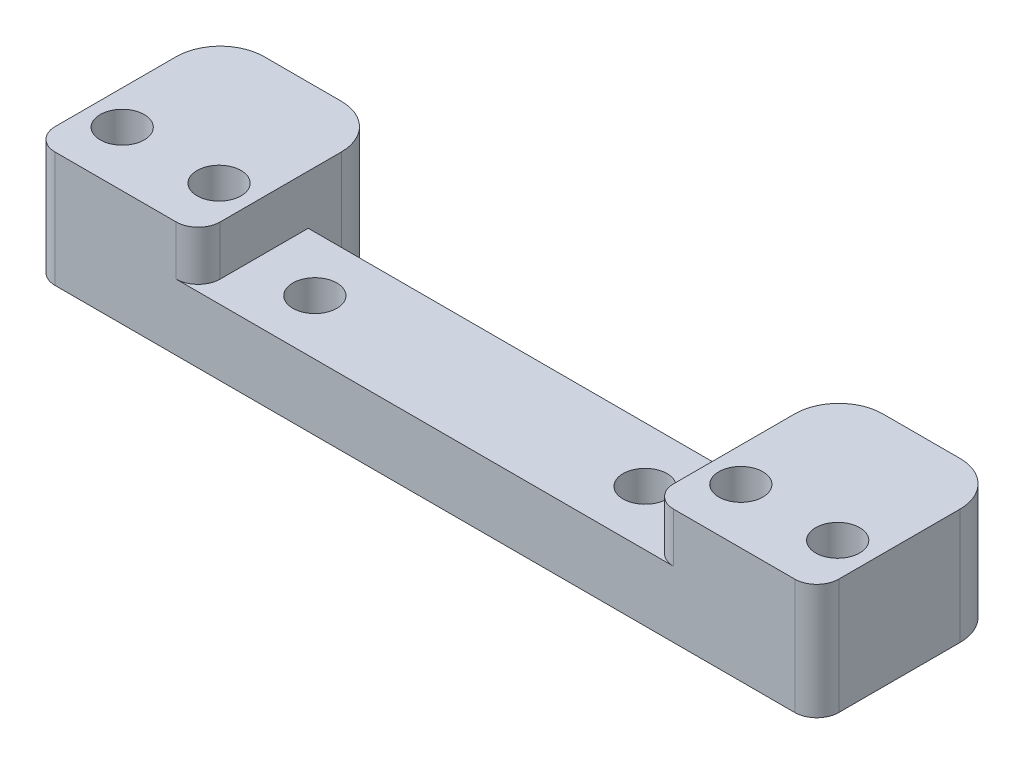
ISO-10303-21;
HEADER;
FILE_DESCRIPTION(('STEP AP214'),'2;1');
FILE_NAME('part.step','',(''),(''),'','','');
FILE_SCHEMA(('AUTOMOTIVE_DESIGN { 1 0 10303 214 1 1 1 1 }'));
ENDSEC;
DATA;
#1=APPLICATION_CONTEXT('core data for automotive mechanical design processes');
#2=APPLICATION_PROTOCOL_DEFINITION('international standard','automotive_design',2000,#1);
#3=PRODUCT_CONTEXT('',#1,'mechanical');
#4=PRODUCT('Part','Part','',(#3));
#5=PRODUCT_RELATED_PRODUCT_CATEGORY('part','',(#4));
#6=PRODUCT_DEFINITION_FORMATION('','',#4);
#7=PRODUCT_DEFINITION_CONTEXT('part definition',#1,'design');
#8=PRODUCT_DEFINITION('design','',#6,#7);
#9=PRODUCT_DEFINITION_SHAPE('','',#8);
#10=(LENGTH_UNIT() NAMED_UNIT(*) SI_UNIT(.MILLI.,.METRE.));
#11=(NAMED_UNIT(*) PLANE_ANGLE_UNIT() SI_UNIT($,.RADIAN.));
#12=(NAMED_UNIT(*) SI_UNIT($,.STERADIAN.) SOLID_ANGLE_UNIT());
#13=UNCERTAINTY_MEASURE_WITH_UNIT(LENGTH_MEASURE(1.E-05),#10,'distance_accuracy_value','');
#14=(GEOMETRIC_REPRESENTATION_CONTEXT(3) GLOBAL_UNCERTAINTY_ASSIGNED_CONTEXT((#13)) GLOBAL_UNIT_ASSIGNED_CONTEXT((#10,
#11,#12)) REPRESENTATION_CONTEXT('',''));
#15=CARTESIAN_POINT('',(0.,0.,0.));
#16=DIRECTION('',(0.,0.,1.));
#17=DIRECTION('',(1.,0.,0.));
#18=AXIS2_PLACEMENT_3D('',#15,#16,#17);
#19=CARTESIAN_POINT('',(0.,6.,0.));
#20=DIRECTION('',(0.,1.,0.));
#21=DIRECTION('',(0.,0.,1.));
#22=AXIS2_PLACEMENT_3D('',#19,#20,#21);
#23=PLANE('',#22);
#24=CARTESIAN_POINT('',(15.,6.,0.));
#25=DIRECTION('',(0.,1.,0.));
#26=DIRECTION('',(0.,0.,1.));
#27=AXIS2_PLACEMENT_3D('',#24,#25,#26);
#28=CIRCLE('',#27,2.);
#29=CARTESIAN_POINT('',(15.,6.,2.));
#30=VERTEX_POINT('',#29);
#31=EDGE_CURVE('E245',#30,#30,#28,.T.);
#32=ORIENTED_EDGE('',*,*,#31,.F.);
#33=EDGE_LOOP('',(#32));
#34=FACE_BOUND('',#33,.T.);
#35=CARTESIAN_POINT('',(-15.,6.,0.));
#36=DIRECTION('',(0.,1.,0.));
#37=DIRECTION('',(0.,0.,1.));
#38=AXIS2_PLACEMENT_3D('',#35,#36,#37);
#39=CIRCLE('',#38,2.);
#40=CARTESIAN_POINT('',(-15.,6.,1.99999999999999));
#41=VERTEX_POINT('',#40);
#42=EDGE_CURVE('E251',#41,#41,#39,.T.);
#43=ORIENTED_EDGE('',*,*,#42,.F.);
#44=EDGE_LOOP('',(#43));
#45=FACE_BOUND('',#44,.T.);
#46=DIRECTION('',(-1.,0.,0.));
#47=VECTOR('',#46,1.);
#48=CARTESIAN_POINT('',(-35.6,6.,-5.));
#49=LINE('',#48,#47);
#50=CARTESIAN_POINT('',(20.6,6.,-5.00000000000001));
#51=VERTEX_POINT('',#50);
#52=CARTESIAN_POINT('',(-20.6,6.,-5.));
#53=VERTEX_POINT('',#52);
#54=EDGE_CURVE('E269',#51,#53,#49,.T.);
#55=ORIENTED_EDGE('',*,*,#54,.T.);
#56=DIRECTION('',(0.,0.,-1.));
#57=VECTOR('',#56,1.);
#58=CARTESIAN_POINT('',(-20.6,6.,5.));
#59=LINE('',#58,#57);
#60=CARTESIAN_POINT('',(-20.6,6.,3.));
#61=VERTEX_POINT('',#60);
#62=EDGE_CURVE('E200',#61,#53,#59,.T.);
#63=ORIENTED_EDGE('',*,*,#62,.F.);
#64=CARTESIAN_POINT('',(-22.6,6.,3.));
#65=DIRECTION('',(0.,1.,0.));
#66=DIRECTION('',(0.,0.,1.));
#67=AXIS2_PLACEMENT_3D('',#64,#65,#66);
#68=CIRCLE('',#67,2.);
#69=CARTESIAN_POINT('',(-22.6,6.,5.));
#70=VERTEX_POINT('',#69);
#71=EDGE_CURVE('E11',#61,#70,#68,.F.);
#72=ORIENTED_EDGE('',*,*,#71,.T.);
#73=DIRECTION('',(1.,0.,0.));
#74=VECTOR('',#73,1.);
#75=CARTESIAN_POINT('',(-35.6,6.,5.));
#76=LINE('',#75,#74);
#77=CARTESIAN_POINT('',(22.6,6.,4.99999999999999));
#78=VERTEX_POINT('',#77);
#79=EDGE_CURVE('E272',#70,#78,#76,.T.);
#80=ORIENTED_EDGE('',*,*,#79,.T.);
#81=CARTESIAN_POINT('',(22.6,6.,2.99999999999999));
#82=DIRECTION('',(0.,1.,0.));
#83=DIRECTION('',(0.,0.,1.));
#84=AXIS2_PLACEMENT_3D('',#81,#82,#83);
#85=CIRCLE('',#84,2.);
#86=CARTESIAN_POINT('',(20.6,6.,2.99999999999999));
#87=VERTEX_POINT('',#86);
#88=EDGE_CURVE('E48',#78,#87,#85,.F.);
#89=ORIENTED_EDGE('',*,*,#88,.T.);
#90=DIRECTION('',(0.,0.,1.));
#91=VECTOR('',#90,1.);
#92=CARTESIAN_POINT('',(20.6,6.,-8.));
#93=LINE('',#92,#91);
#94=EDGE_CURVE('E184',#51,#87,#93,.T.);
#95=ORIENTED_EDGE('',*,*,#94,.F.);
#96=EDGE_LOOP('',(#55,#63,#72,#80,#89,#95));
#97=FACE_BOUND('',#96,.T.);
#98=ADVANCED_FACE('F40',(#34,#45,#97),#23,.T.);
#99=CARTESIAN_POINT('',(0.,0.,0.));
#100=DIRECTION('',(0.,1.,0.));
#101=DIRECTION('',(0.,0.,1.));
#102=AXIS2_PLACEMENT_3D('',#99,#100,#101);
#103=PLANE('',#102);
#104=DIRECTION('',(0.,0.,-1.));
#105=VECTOR('',#104,1.);
#106=CARTESIAN_POINT('',(35.6,0.,-5.00000000000001));
#107=LINE('',#106,#105);
#108=CARTESIAN_POINT('',(35.6,0.,2.99999999999999));
#109=VERTEX_POINT('',#108);
#110=CARTESIAN_POINT('',(35.6,0.,-8.));
#111=VERTEX_POINT('',#110);
#112=EDGE_CURVE('E268',#109,#111,#107,.T.);
#113=ORIENTED_EDGE('',*,*,#112,.F.);
#114=CARTESIAN_POINT('',(33.6,0.,2.99999999999999));
#115=DIRECTION('',(0.,1.,0.));
#116=DIRECTION('',(0.,0.,1.));
#117=AXIS2_PLACEMENT_3D('',#114,#115,#116);
#118=CIRCLE('',#117,2.);
#119=CARTESIAN_POINT('',(33.6,0.,4.99999999999999));
#120=VERTEX_POINT('',#119);
#121=EDGE_CURVE('E310',#109,#120,#118,.F.);
#122=ORIENTED_EDGE('',*,*,#121,.T.);
#123=DIRECTION('',(1.,0.,0.));
#124=VECTOR('',#123,1.);
#125=CARTESIAN_POINT('',(-35.6,0.,5.));
#126=LINE('',#125,#124);
#127=CARTESIAN_POINT('',(-33.6,0.,5.));
#128=VERTEX_POINT('',#127);
#129=EDGE_CURVE('E273',#128,#120,#126,.T.);
#130=ORIENTED_EDGE('',*,*,#129,.F.);
#131=CARTESIAN_POINT('',(-33.6,0.,3.));
#132=DIRECTION('',(0.,1.,0.));
#133=DIRECTION('',(0.,0.,1.));
#134=AXIS2_PLACEMENT_3D('',#131,#132,#133);
#135=CIRCLE('',#134,2.);
#136=CARTESIAN_POINT('',(-35.6,0.,3.));
#137=VERTEX_POINT('',#136);
#138=EDGE_CURVE('E308',#128,#137,#135,.F.);
#139=ORIENTED_EDGE('',*,*,#138,.T.);
#140=DIRECTION('',(0.,0.,1.));
#141=VECTOR('',#140,1.);
#142=CARTESIAN_POINT('',(-35.6,0.,-5.));
#143=LINE('',#142,#141);
#144=CARTESIAN_POINT('',(-35.6,0.,-8.));
#145=VERTEX_POINT('',#144);
#146=EDGE_CURVE('E280',#145,#137,#143,.T.);
#147=ORIENTED_EDGE('',*,*,#146,.F.);
#148=CARTESIAN_POINT('',(-31.6,0.,-8.));
#149=DIRECTION('',(0.,1.,0.));
#150=DIRECTION('',(0.,0.,1.));
#151=AXIS2_PLACEMENT_3D('',#148,#149,#150);
#152=CIRCLE('',#151,4.);
#153=CARTESIAN_POINT('',(-31.6,0.,-12.));
#154=VERTEX_POINT('',#153);
#155=EDGE_CURVE('E293',#145,#154,#152,.F.);
#156=ORIENTED_EDGE('',*,*,#155,.T.);
#157=DIRECTION('',(1.,0.,0.));
#158=VECTOR('',#157,1.);
#159=CARTESIAN_POINT('',(-35.6,0.,-12.));
#160=LINE('',#159,#158);
#161=CARTESIAN_POINT('',(-24.6,0.,-12.));
#162=VERTEX_POINT('',#161);
#163=EDGE_CURVE('E238',#154,#162,#160,.T.);
#164=ORIENTED_EDGE('',*,*,#163,.T.);
#165=CARTESIAN_POINT('',(-24.6,0.,-8.));
#166=DIRECTION('',(0.,1.,0.));
#167=DIRECTION('',(0.,0.,1.));
#168=AXIS2_PLACEMENT_3D('',#165,#166,#167);
#169=CIRCLE('',#168,4.);
#170=CARTESIAN_POINT('',(-20.6,0.,-8.));
#171=VERTEX_POINT('',#170);
#172=EDGE_CURVE('E291',#162,#171,#169,.F.);
#173=ORIENTED_EDGE('',*,*,#172,.T.);
#174=DIRECTION('',(0.,0.,1.));
#175=VECTOR('',#174,1.);
#176=CARTESIAN_POINT('',(-20.6,0.,5.));
#177=LINE('',#176,#175);
#178=CARTESIAN_POINT('',(-20.6,0.,-5.));
#179=VERTEX_POINT('',#178);
#180=EDGE_CURVE('E181',#171,#179,#177,.T.);
#181=ORIENTED_EDGE('',*,*,#180,.T.);
#182=DIRECTION('',(-1.,0.,0.));
#183=VECTOR('',#182,1.);
#184=CARTESIAN_POINT('',(-35.6,0.,-5.));
#185=LINE('',#184,#183);
#186=CARTESIAN_POINT('',(20.6,0.,-5.00000000000001));
#187=VERTEX_POINT('',#186);
#188=EDGE_CURVE('E277',#187,#179,#185,.T.);
#189=ORIENTED_EDGE('',*,*,#188,.F.);
#190=DIRECTION('',(0.,0.,-1.));
#191=VECTOR('',#190,1.);
#192=CARTESIAN_POINT('',(20.6,0.,5.));
#193=LINE('',#192,#191);
#194=CARTESIAN_POINT('',(20.6,0.,-8.));
#195=VERTEX_POINT('',#194);
#196=EDGE_CURVE('E225',#187,#195,#193,.T.);
#197=ORIENTED_EDGE('',*,*,#196,.T.);
#198=CARTESIAN_POINT('',(24.6,0.,-8.));
#199=DIRECTION('',(0.,1.,0.));
#200=DIRECTION('',(0.,0.,1.));
#201=AXIS2_PLACEMENT_3D('',#198,#199,#200);
#202=CIRCLE('',#201,4.);
#203=CARTESIAN_POINT('',(24.6,0.,-12.));
#204=VERTEX_POINT('',#203);
#205=EDGE_CURVE('E295',#195,#204,#202,.F.);
#206=ORIENTED_EDGE('',*,*,#205,.T.);
#207=DIRECTION('',(1.,0.,0.));
#208=VECTOR('',#207,1.);
#209=CARTESIAN_POINT('',(35.6,0.,-12.));
#210=LINE('',#209,#208);
#211=CARTESIAN_POINT('',(31.6,0.,-12.));
#212=VERTEX_POINT('',#211);
#213=EDGE_CURVE('E229',#204,#212,#210,.T.);
#214=ORIENTED_EDGE('',*,*,#213,.T.);
#215=CARTESIAN_POINT('',(31.6,0.,-8.));
#216=DIRECTION('',(0.,1.,0.));
#217=DIRECTION('',(0.,0.,1.));
#218=AXIS2_PLACEMENT_3D('',#215,#216,#217);
#219=CIRCLE('',#218,4.);
#220=EDGE_CURVE('E297',#212,#111,#219,.F.);
#221=ORIENTED_EDGE('',*,*,#220,.T.);
#222=EDGE_LOOP('',(#113,#122,#130,#139,#147,#156,#164,#173,#181,#189,#197,#206,#214,#221));
#223=FACE_BOUND('',#222,.T.);
#224=CARTESIAN_POINT('',(-15.,0.,0.));
#225=DIRECTION('',(0.,1.,0.));
#226=DIRECTION('',(0.,0.,1.));
#227=AXIS2_PLACEMENT_3D('',#224,#225,#226);
#228=CIRCLE('',#227,2.);
#229=CARTESIAN_POINT('',(-15.,0.,1.99999999999999));
#230=VERTEX_POINT('',#229);
#231=EDGE_CURVE('E248',#230,#230,#228,.T.);
#232=ORIENTED_EDGE('',*,*,#231,.T.);
#233=EDGE_LOOP('',(#232));
#234=FACE_BOUND('',#233,.T.);
#235=CARTESIAN_POINT('',(15.,0.,0.));
#236=DIRECTION('',(0.,1.,0.));
#237=DIRECTION('',(0.,0.,1.));
#238=AXIS2_PLACEMENT_3D('',#235,#236,#237);
#239=CIRCLE('',#238,2.);
#240=CARTESIAN_POINT('',(15.,0.,2.));
#241=VERTEX_POINT('',#240);
#242=EDGE_CURVE('E244',#241,#241,#239,.T.);
#243=ORIENTED_EDGE('',*,*,#242,.T.);
#244=EDGE_LOOP('',(#243));
#245=FACE_BOUND('',#244,.T.);
#246=CARTESIAN_POINT('',(-23.7,0.,0.));
#247=DIRECTION('',(0.,1.,0.));
#248=DIRECTION('',(0.,0.,1.));
#249=AXIS2_PLACEMENT_3D('',#246,#247,#248);
#250=CIRCLE('',#249,2.);
#251=CARTESIAN_POINT('',(-23.7,0.,2.));
#252=VERTEX_POINT('',#251);
#253=EDGE_CURVE('E262',#252,#252,#250,.T.);
#254=ORIENTED_EDGE('',*,*,#253,.T.);
#255=EDGE_LOOP('',(#254));
#256=FACE_BOUND('',#255,.T.);
#257=CARTESIAN_POINT('',(-32.5,0.,0.));
#258=DIRECTION('',(0.,1.,0.));
#259=DIRECTION('',(0.,0.,1.));
#260=AXIS2_PLACEMENT_3D('',#257,#258,#259);
#261=CIRCLE('',#260,2.);
#262=CARTESIAN_POINT('',(-32.5,0.,2.));
#263=VERTEX_POINT('',#262);
#264=EDGE_CURVE('E265',#263,#263,#261,.T.);
#265=ORIENTED_EDGE('',*,*,#264,.T.);
#266=EDGE_LOOP('',(#265));
#267=FACE_BOUND('',#266,.T.);
#268=CARTESIAN_POINT('',(32.5,0.,0.));
#269=DIRECTION('',(0.,1.,0.));
#270=DIRECTION('',(0.,0.,1.));
#271=AXIS2_PLACEMENT_3D('',#268,#269,#270);
#272=CIRCLE('',#271,2.);
#273=CARTESIAN_POINT('',(32.5,0.,2.));
#274=VERTEX_POINT('',#273);
#275=EDGE_CURVE('E254',#274,#274,#272,.T.);
#276=ORIENTED_EDGE('',*,*,#275,.T.);
#277=EDGE_LOOP('',(#276));
#278=FACE_BOUND('',#277,.T.);
#279=CARTESIAN_POINT('',(23.7,0.,0.));
#280=DIRECTION('',(0.,1.,0.));
#281=DIRECTION('',(0.,0.,1.));
#282=AXIS2_PLACEMENT_3D('',#279,#280,#281);
#283=CIRCLE('',#282,2.);
#284=CARTESIAN_POINT('',(23.7,0.,2.));
#285=VERTEX_POINT('',#284);
#286=EDGE_CURVE('E259',#285,#285,#283,.T.);
#287=ORIENTED_EDGE('',*,*,#286,.T.);
#288=EDGE_LOOP('',(#287));
#289=FACE_BOUND('',#288,.T.);
#290=ADVANCED_FACE('F376',(#223,#234,#245,#256,#267,#278,#289),#103,.F.);
#291=CARTESIAN_POINT('',(35.6,6.,-5.00000000000001));
#292=DIRECTION('',(-1.,0.,0.));
#293=DIRECTION('',(0.,0.,1.));
#294=AXIS2_PLACEMENT_3D('',#291,#292,#293);
#295=PLANE('',#294);
#296=DIRECTION('',(0.,0.,-1.));
#297=VECTOR('',#296,1.);
#298=CARTESIAN_POINT('',(35.6,10.5,4.99999999999999));
#299=LINE('',#298,#297);
#300=CARTESIAN_POINT('',(35.6,10.5,2.99999999999999));
#301=VERTEX_POINT('',#300);
#302=CARTESIAN_POINT('',(35.6,10.5,-8.));
#303=VERTEX_POINT('',#302);
#304=EDGE_CURVE('E223',#301,#303,#299,.T.);
#305=ORIENTED_EDGE('',*,*,#304,.F.);
#306=DIRECTION('',(0.,-1.,0.));
#307=VECTOR('',#306,1.);
#308=CARTESIAN_POINT('',(35.6,6.,2.99999999999999));
#309=LINE('',#308,#307);
#310=EDGE_CURVE('E228',#301,#109,#309,.T.);
#311=ORIENTED_EDGE('',*,*,#310,.T.);
#312=ORIENTED_EDGE('',*,*,#112,.T.);
#313=DIRECTION('',(0.,1.,0.));
#314=VECTOR('',#313,1.);
#315=CARTESIAN_POINT('',(35.6,6.,-8.));
#316=LINE('',#315,#314);
#317=EDGE_CURVE('E275',#111,#303,#316,.T.);
#318=ORIENTED_EDGE('',*,*,#317,.T.);
#319=EDGE_LOOP('',(#305,#311,#312,#318));
#320=FACE_BOUND('',#319,.T.);
#321=ADVANCED_FACE('F361',(#320),#295,.F.);
#322=CARTESIAN_POINT('',(-35.6,6.,-5.));
#323=DIRECTION('',(0.,0.,1.));
#324=DIRECTION('',(1.,0.,0.));
#325=AXIS2_PLACEMENT_3D('',#322,#323,#324);
#326=PLANE('',#325);
#327=ORIENTED_EDGE('',*,*,#54,.F.);
#328=DIRECTION('',(0.,-1.,0.));
#329=VECTOR('',#328,1.);
#330=CARTESIAN_POINT('',(20.6,6.,-5.00000000000001));
#331=LINE('',#330,#329);
#332=EDGE_CURVE('E232',#51,#187,#331,.T.);
#333=ORIENTED_EDGE('',*,*,#332,.T.);
#334=ORIENTED_EDGE('',*,*,#188,.T.);
#335=DIRECTION('',(0.,1.,0.));
#336=VECTOR('',#335,1.);
#337=CARTESIAN_POINT('',(-20.6,6.,-5.));
#338=LINE('',#337,#336);
#339=EDGE_CURVE('E241',#179,#53,#338,.T.);
#340=ORIENTED_EDGE('',*,*,#339,.T.);
#341=EDGE_LOOP('',(#327,#333,#334,#340));
#342=FACE_BOUND('',#341,.T.);
#343=ADVANCED_FACE('F380',(#342),#326,.F.);
#344=CARTESIAN_POINT('',(-35.6,6.,-5.));
#345=DIRECTION('',(1.,0.,0.));
#346=DIRECTION('',(0.,0.,-1.));
#347=AXIS2_PLACEMENT_3D('',#344,#345,#346);
#348=PLANE('',#347);
#349=ORIENTED_EDGE('',*,*,#146,.T.);
#350=DIRECTION('',(0.,-1.,0.));
#351=VECTOR('',#350,1.);
#352=CARTESIAN_POINT('',(-35.6,6.,3.));
#353=LINE('',#352,#351);
#354=CARTESIAN_POINT('',(-35.6,10.5,3.));
#355=VERTEX_POINT('',#354);
#356=EDGE_CURVE('E328',#137,#355,#353,.F.);
#357=ORIENTED_EDGE('',*,*,#356,.T.);
#358=DIRECTION('',(0.,0.,1.));
#359=VECTOR('',#358,1.);
#360=CARTESIAN_POINT('',(-35.6,10.5,-8.));
#361=LINE('',#360,#359);
#362=CARTESIAN_POINT('',(-35.6,10.5,-8.));
#363=VERTEX_POINT('',#362);
#364=EDGE_CURVE('E197',#363,#355,#361,.T.);
#365=ORIENTED_EDGE('',*,*,#364,.F.);
#366=DIRECTION('',(0.,1.,0.));
#367=VECTOR('',#366,1.);
#368=CARTESIAN_POINT('',(-35.6,0.,-8.));
#369=LINE('',#368,#367);
#370=EDGE_CURVE('E185',#363,#145,#369,.F.);
#371=ORIENTED_EDGE('',*,*,#370,.T.);
#372=EDGE_LOOP('',(#349,#357,#365,#371));
#373=FACE_BOUND('',#372,.T.);
#374=ADVANCED_FACE('F418',(#373),#348,.F.);
#375=CARTESIAN_POINT('',(-35.6,6.,5.));
#376=DIRECTION('',(0.,0.,-1.));
#377=DIRECTION('',(-1.,0.,0.));
#378=AXIS2_PLACEMENT_3D('',#375,#376,#377);
#379=PLANE('',#378);
#380=ORIENTED_EDGE('',*,*,#129,.T.);
#381=DIRECTION('',(0.,-1.,0.));
#382=VECTOR('',#381,1.);
#383=CARTESIAN_POINT('',(33.6,6.,4.99999999999999));
#384=LINE('',#383,#382);
#385=CARTESIAN_POINT('',(33.6,10.5,4.99999999999999));
#386=VERTEX_POINT('',#385);
#387=EDGE_CURVE('E320',#120,#386,#384,.F.);
#388=ORIENTED_EDGE('',*,*,#387,.T.);
#389=DIRECTION('',(1.,0.,0.));
#390=VECTOR('',#389,1.);
#391=CARTESIAN_POINT('',(20.6,10.5,4.99999999999999));
#392=LINE('',#391,#390);
#393=CARTESIAN_POINT('',(22.6,10.5,4.99999999999999));
#394=VERTEX_POINT('',#393);
#395=EDGE_CURVE('E220',#394,#386,#392,.T.);
#396=ORIENTED_EDGE('',*,*,#395,.F.);
#397=DIRECTION('',(0.,-1.,0.));
#398=VECTOR('',#397,1.);
#399=CARTESIAN_POINT('',(22.6,6.,4.99999999999999));
#400=LINE('',#399,#398);
#401=EDGE_CURVE('E317',#394,#78,#400,.T.);
#402=ORIENTED_EDGE('',*,*,#401,.T.);
#403=ORIENTED_EDGE('',*,*,#79,.F.);
#404=DIRECTION('',(0.,-1.,0.));
#405=VECTOR('',#404,1.);
#406=CARTESIAN_POINT('',(-22.6,10.5,5.));
#407=LINE('',#406,#405);
#408=CARTESIAN_POINT('',(-22.6,10.5,5.));
#409=VERTEX_POINT('',#408);
#410=EDGE_CURVE('E312',#70,#409,#407,.F.);
#411=ORIENTED_EDGE('',*,*,#410,.T.);
#412=DIRECTION('',(1.,0.,0.));
#413=VECTOR('',#412,1.);
#414=CARTESIAN_POINT('',(-35.6,10.5,5.));
#415=LINE('',#414,#413);
#416=CARTESIAN_POINT('',(-33.6,10.5,5.));
#417=VERTEX_POINT('',#416);
#418=EDGE_CURVE('E174',#417,#409,#415,.T.);
#419=ORIENTED_EDGE('',*,*,#418,.F.);
#420=DIRECTION('',(0.,-1.,0.));
#421=VECTOR('',#420,1.);
#422=CARTESIAN_POINT('',(-33.6,6.,5.));
#423=LINE('',#422,#421);
#424=EDGE_CURVE('E314',#417,#128,#423,.T.);
#425=ORIENTED_EDGE('',*,*,#424,.T.);
#426=EDGE_LOOP('',(#380,#388,#396,#402,#403,#411,#419,#425));
#427=FACE_BOUND('',#426,.T.);
#428=ADVANCED_FACE('F353',(#427),#379,.F.);
#429=CARTESIAN_POINT('',(-32.5,6.,0.));
#430=DIRECTION('',(0.,-1.,0.));
#431=DIRECTION('',(0.,0.,-1.));
#432=AXIS2_PLACEMENT_3D('',#429,#430,#431);
#433=CYLINDRICAL_SURFACE('',#432,2.);
#434=ORIENTED_EDGE('',*,*,#264,.F.);
#435=EDGE_LOOP('',(#434));
#436=FACE_BOUND('',#435,.T.);
#437=CARTESIAN_POINT('',(-32.5,10.5,0.));
#438=DIRECTION('',(0.,1.,0.));
#439=DIRECTION('',(0.,0.,1.));
#440=AXIS2_PLACEMENT_3D('',#437,#438,#439);
#441=CIRCLE('',#440,2.);
#442=CARTESIAN_POINT('',(-32.5,10.5,2.));
#443=VERTEX_POINT('',#442);
#444=EDGE_CURVE('E388',#443,#443,#441,.T.);
#445=ORIENTED_EDGE('',*,*,#444,.T.);
#446=EDGE_LOOP('',(#445));
#447=FACE_BOUND('',#446,.T.);
#448=ADVANCED_FACE('F392',(#436,#447),#433,.F.);
#449=CARTESIAN_POINT('',(-23.7,6.,0.));
#450=DIRECTION('',(0.,-1.,0.));
#451=DIRECTION('',(0.,0.,-1.));
#452=AXIS2_PLACEMENT_3D('',#449,#450,#451);
#453=CYLINDRICAL_SURFACE('',#452,2.);
#454=ORIENTED_EDGE('',*,*,#253,.F.);
#455=EDGE_LOOP('',(#454));
#456=FACE_BOUND('',#455,.T.);
#457=CARTESIAN_POINT('',(-23.7,10.5,0.));
#458=DIRECTION('',(0.,1.,0.));
#459=DIRECTION('',(0.,0.,1.));
#460=AXIS2_PLACEMENT_3D('',#457,#458,#459);
#461=CIRCLE('',#460,2.);
#462=CARTESIAN_POINT('',(-23.7,10.5,2.));
#463=VERTEX_POINT('',#462);
#464=EDGE_CURVE('E202',#463,#463,#461,.T.);
#465=ORIENTED_EDGE('',*,*,#464,.T.);
#466=EDGE_LOOP('',(#465));
#467=FACE_BOUND('',#466,.T.);
#468=ADVANCED_FACE('F473',(#456,#467),#453,.F.);
#469=CARTESIAN_POINT('',(23.7,6.,0.));
#470=DIRECTION('',(0.,-1.,0.));
#471=DIRECTION('',(0.,0.,-1.));
#472=AXIS2_PLACEMENT_3D('',#469,#470,#471);
#473=CYLINDRICAL_SURFACE('',#472,2.);
#474=ORIENTED_EDGE('',*,*,#286,.F.);
#475=EDGE_LOOP('',(#474));
#476=FACE_BOUND('',#475,.T.);
#477=CARTESIAN_POINT('',(23.7,10.5,0.));
#478=DIRECTION('',(0.,1.,0.));
#479=DIRECTION('',(0.,0.,1.));
#480=AXIS2_PLACEMENT_3D('',#477,#478,#479);
#481=CIRCLE('',#480,2.);
#482=CARTESIAN_POINT('',(23.7,10.5,2.));
#483=VERTEX_POINT('',#482);
#484=EDGE_CURVE('E199',#483,#483,#481,.T.);
#485=ORIENTED_EDGE('',*,*,#484,.T.);
#486=EDGE_LOOP('',(#485));
#487=FACE_BOUND('',#486,.T.);
#488=ADVANCED_FACE('F470',(#476,#487),#473,.F.);
#489=CARTESIAN_POINT('',(32.5,6.,0.));
#490=DIRECTION('',(0.,-1.,0.));
#491=DIRECTION('',(0.,0.,-1.));
#492=AXIS2_PLACEMENT_3D('',#489,#490,#491);
#493=CYLINDRICAL_SURFACE('',#492,2.);
#494=ORIENTED_EDGE('',*,*,#275,.F.);
#495=EDGE_LOOP('',(#494));
#496=FACE_BOUND('',#495,.T.);
#497=CARTESIAN_POINT('',(32.5,10.5,0.));
#498=DIRECTION('',(0.,1.,0.));
#499=DIRECTION('',(0.,0.,1.));
#500=AXIS2_PLACEMENT_3D('',#497,#498,#499);
#501=CIRCLE('',#500,2.);
#502=CARTESIAN_POINT('',(32.5,10.5,2.));
#503=VERTEX_POINT('',#502);
#504=EDGE_CURVE('E205',#503,#503,#501,.T.);
#505=ORIENTED_EDGE('',*,*,#504,.T.);
#506=EDGE_LOOP('',(#505));
#507=FACE_BOUND('',#506,.T.);
#508=ADVANCED_FACE('F466',(#496,#507),#493,.F.);
#509=CARTESIAN_POINT('',(-15.,6.,0.));
#510=DIRECTION('',(0.,-1.,0.));
#511=DIRECTION('',(0.,0.,-1.));
#512=AXIS2_PLACEMENT_3D('',#509,#510,#511);
#513=CYLINDRICAL_SURFACE('',#512,2.);
#514=ORIENTED_EDGE('',*,*,#42,.T.);
#515=EDGE_LOOP('',(#514));
#516=FACE_BOUND('',#515,.T.);
#517=ORIENTED_EDGE('',*,*,#231,.F.);
#518=EDGE_LOOP('',(#517));
#519=FACE_BOUND('',#518,.T.);
#520=ADVANCED_FACE('F462',(#516,#519),#513,.F.);
#521=CARTESIAN_POINT('',(15.,6.,0.));
#522=DIRECTION('',(0.,-1.,0.));
#523=DIRECTION('',(0.,0.,-1.));
#524=AXIS2_PLACEMENT_3D('',#521,#522,#523);
#525=CYLINDRICAL_SURFACE('',#524,2.);
#526=ORIENTED_EDGE('',*,*,#31,.T.);
#527=EDGE_LOOP('',(#526));
#528=FACE_BOUND('',#527,.T.);
#529=ORIENTED_EDGE('',*,*,#242,.F.);
#530=EDGE_LOOP('',(#529));
#531=FACE_BOUND('',#530,.T.);
#532=ADVANCED_FACE('F459',(#528,#531),#525,.F.);
#533=CARTESIAN_POINT('',(-20.6,-22.6715680975093,5.));
#534=DIRECTION('',(1.,0.,0.));
#535=DIRECTION('',(0.,0.,-1.));
#536=AXIS2_PLACEMENT_3D('',#533,#534,#535);
#537=PLANE('',#536);
#538=DIRECTION('',(0.,0.,-1.));
#539=VECTOR('',#538,1.);
#540=CARTESIAN_POINT('',(-20.6,10.5,5.));
#541=LINE('',#540,#539);
#542=CARTESIAN_POINT('',(-20.6,10.5,3.));
#543=VERTEX_POINT('',#542);
#544=CARTESIAN_POINT('',(-20.6,10.5,-8.));
#545=VERTEX_POINT('',#544);
#546=EDGE_CURVE('E164',#543,#545,#541,.T.);
#547=ORIENTED_EDGE('',*,*,#546,.F.);
#548=DIRECTION('',(0.,-1.,0.));
#549=VECTOR('',#548,1.);
#550=CARTESIAN_POINT('',(-20.6,6.,3.));
#551=LINE('',#550,#549);
#552=EDGE_CURVE('E333',#543,#61,#551,.T.);
#553=ORIENTED_EDGE('',*,*,#552,.T.);
#554=ORIENTED_EDGE('',*,*,#62,.T.);
#555=ORIENTED_EDGE('',*,*,#339,.F.);
#556=ORIENTED_EDGE('',*,*,#180,.F.);
#557=DIRECTION('',(0.,1.,0.));
#558=VECTOR('',#557,1.);
#559=CARTESIAN_POINT('',(-20.6,-22.6715680975093,-8.));
#560=LINE('',#559,#558);
#561=EDGE_CURVE('E178',#171,#545,#560,.T.);
#562=ORIENTED_EDGE('',*,*,#561,.T.);
#563=EDGE_LOOP('',(#547,#553,#554,#555,#556,#562));
#564=FACE_BOUND('',#563,.T.);
#565=ADVANCED_FACE('F179',(#564),#537,.T.);
#566=CARTESIAN_POINT('',(-35.6,-22.6715680975093,-12.));
#567=DIRECTION('',(0.,0.,-1.));
#568=DIRECTION('',(-1.,0.,0.));
#569=AXIS2_PLACEMENT_3D('',#566,#567,#568);
#570=PLANE('',#569);
#571=ORIENTED_EDGE('',*,*,#163,.F.);
#572=DIRECTION('',(0.,1.,0.));
#573=VECTOR('',#572,1.);
#574=CARTESIAN_POINT('',(-31.6,6.,-12.));
#575=LINE('',#574,#573);
#576=CARTESIAN_POINT('',(-31.6,10.5,-12.));
#577=VERTEX_POINT('',#576);
#578=EDGE_CURVE('E303',#154,#577,#575,.T.);
#579=ORIENTED_EDGE('',*,*,#578,.T.);
#580=DIRECTION('',(-1.,0.,0.));
#581=VECTOR('',#580,1.);
#582=CARTESIAN_POINT('',(-24.6,10.5,-12.));
#583=LINE('',#582,#581);
#584=CARTESIAN_POINT('',(-24.6,10.5,-12.));
#585=VERTEX_POINT('',#584);
#586=EDGE_CURVE('E189',#585,#577,#583,.T.);
#587=ORIENTED_EDGE('',*,*,#586,.F.);
#588=DIRECTION('',(0.,1.,0.));
#589=VECTOR('',#588,1.);
#590=CARTESIAN_POINT('',(-24.6,-22.6715680975093,-12.));
#591=LINE('',#590,#589);
#592=EDGE_CURVE('E188',#585,#162,#591,.F.);
#593=ORIENTED_EDGE('',*,*,#592,.T.);
#594=EDGE_LOOP('',(#571,#579,#587,#593));
#595=FACE_BOUND('',#594,.T.);
#596=ADVANCED_FACE('F451',(#595),#570,.T.);
#597=CARTESIAN_POINT('',(20.6,-22.6715680975093,5.));
#598=DIRECTION('',(-1.,0.,0.));
#599=DIRECTION('',(0.,0.,1.));
#600=AXIS2_PLACEMENT_3D('',#597,#598,#599);
#601=PLANE('',#600);
#602=ORIENTED_EDGE('',*,*,#94,.T.);
#603=DIRECTION('',(0.,-1.,0.));
#604=VECTOR('',#603,1.);
#605=CARTESIAN_POINT('',(20.6,10.5,2.99999999999999));
#606=LINE('',#605,#604);
#607=CARTESIAN_POINT('',(20.6,10.5,2.99999999999999));
#608=VERTEX_POINT('',#607);
#609=EDGE_CURVE('E326',#87,#608,#606,.F.);
#610=ORIENTED_EDGE('',*,*,#609,.T.);
#611=DIRECTION('',(0.,0.,1.));
#612=VECTOR('',#611,1.);
#613=CARTESIAN_POINT('',(20.6,10.5,-8.));
#614=LINE('',#613,#612);
#615=CARTESIAN_POINT('',(20.6,10.5,-8.));
#616=VERTEX_POINT('',#615);
#617=EDGE_CURVE('E217',#616,#608,#614,.T.);
#618=ORIENTED_EDGE('',*,*,#617,.F.);
#619=DIRECTION('',(0.,1.,0.));
#620=VECTOR('',#619,1.);
#621=CARTESIAN_POINT('',(20.6,-22.6715680975093,-8.));
#622=LINE('',#621,#620);
#623=EDGE_CURVE('E300',#616,#195,#622,.F.);
#624=ORIENTED_EDGE('',*,*,#623,.T.);
#625=ORIENTED_EDGE('',*,*,#196,.F.);
#626=ORIENTED_EDGE('',*,*,#332,.F.);
#627=EDGE_LOOP('',(#602,#610,#618,#624,#625,#626));
#628=FACE_BOUND('',#627,.T.);
#629=ADVANCED_FACE('F342',(#628),#601,.T.);
#630=CARTESIAN_POINT('',(35.6,-22.6715680975093,-12.));
#631=DIRECTION('',(0.,0.,-1.));
#632=DIRECTION('',(-1.,0.,0.));
#633=AXIS2_PLACEMENT_3D('',#630,#631,#632);
#634=PLANE('',#633);
#635=DIRECTION('',(0.,1.,0.));
#636=VECTOR('',#635,1.);
#637=CARTESIAN_POINT('',(24.6,-22.6715680975093,-12.));
#638=LINE('',#637,#636);
#639=CARTESIAN_POINT('',(24.6,10.5,-12.));
#640=VERTEX_POINT('',#639);
#641=EDGE_CURVE('E287',#204,#640,#638,.T.);
#642=ORIENTED_EDGE('',*,*,#641,.T.);
#643=DIRECTION('',(-1.,0.,0.));
#644=VECTOR('',#643,1.);
#645=CARTESIAN_POINT('',(31.6,10.5,-12.));
#646=LINE('',#645,#644);
#647=CARTESIAN_POINT('',(31.6,10.5,-12.));
#648=VERTEX_POINT('',#647);
#649=EDGE_CURVE('E211',#648,#640,#646,.T.);
#650=ORIENTED_EDGE('',*,*,#649,.F.);
#651=DIRECTION('',(0.,1.,0.));
#652=VECTOR('',#651,1.);
#653=CARTESIAN_POINT('',(31.6,0.,-12.));
#654=LINE('',#653,#652);
#655=EDGE_CURVE('E289',#648,#212,#654,.F.);
#656=ORIENTED_EDGE('',*,*,#655,.T.);
#657=ORIENTED_EDGE('',*,*,#213,.F.);
#658=EDGE_LOOP('',(#642,#650,#656,#657));
#659=FACE_BOUND('',#658,.T.);
#660=ADVANCED_FACE('F428',(#659),#634,.T.);
#661=CARTESIAN_POINT('',(31.6,6.,-8.));
#662=DIRECTION('',(0.,-1.,0.));
#663=DIRECTION('',(0.,0.,-1.));
#664=AXIS2_PLACEMENT_3D('',#661,#662,#663);
#665=CYLINDRICAL_SURFACE('',#664,4.);
#666=ORIENTED_EDGE('',*,*,#220,.F.);
#667=ORIENTED_EDGE('',*,*,#655,.F.);
#668=CARTESIAN_POINT('',(31.6,10.5,-8.));
#669=DIRECTION('',(0.,1.,0.));
#670=DIRECTION('',(0.,0.,1.));
#671=AXIS2_PLACEMENT_3D('',#668,#669,#670);
#672=CIRCLE('',#671,4.);
#673=EDGE_CURVE('E208',#303,#648,#672,.T.);
#674=ORIENTED_EDGE('',*,*,#673,.F.);
#675=ORIENTED_EDGE('',*,*,#317,.F.);
#676=EDGE_LOOP('',(#666,#667,#674,#675));
#677=FACE_BOUND('',#676,.T.);
#678=ADVANCED_FACE('F367',(#677),#665,.T.);
#679=CARTESIAN_POINT('',(24.6,-22.6715680975093,-8.));
#680=DIRECTION('',(0.,1.,0.));
#681=DIRECTION('',(0.,0.,1.));
#682=AXIS2_PLACEMENT_3D('',#679,#680,#681);
#683=CYLINDRICAL_SURFACE('',#682,4.);
#684=ORIENTED_EDGE('',*,*,#205,.F.);
#685=ORIENTED_EDGE('',*,*,#623,.F.);
#686=CARTESIAN_POINT('',(24.6,10.5,-8.));
#687=DIRECTION('',(0.,1.,0.));
#688=DIRECTION('',(0.,0.,1.));
#689=AXIS2_PLACEMENT_3D('',#686,#687,#688);
#690=CIRCLE('',#689,4.);
#691=EDGE_CURVE('E214',#640,#616,#690,.T.);
#692=ORIENTED_EDGE('',*,*,#691,.F.);
#693=ORIENTED_EDGE('',*,*,#641,.F.);
#694=EDGE_LOOP('',(#684,#685,#692,#693));
#695=FACE_BOUND('',#694,.T.);
#696=ADVANCED_FACE('F374',(#695),#683,.T.);
#697=CARTESIAN_POINT('',(-31.6,-22.6715680975093,-8.));
#698=DIRECTION('',(0.,-1.,0.));
#699=DIRECTION('',(0.,0.,-1.));
#700=AXIS2_PLACEMENT_3D('',#697,#698,#699);
#701=CYLINDRICAL_SURFACE('',#700,4.);
#702=ORIENTED_EDGE('',*,*,#155,.F.);
#703=ORIENTED_EDGE('',*,*,#370,.F.);
#704=CARTESIAN_POINT('',(-31.6,10.5,-8.));
#705=DIRECTION('',(0.,1.,0.));
#706=DIRECTION('',(0.,0.,1.));
#707=AXIS2_PLACEMENT_3D('',#704,#705,#706);
#708=CIRCLE('',#707,4.);
#709=EDGE_CURVE('E191',#577,#363,#708,.T.);
#710=ORIENTED_EDGE('',*,*,#709,.F.);
#711=ORIENTED_EDGE('',*,*,#578,.F.);
#712=EDGE_LOOP('',(#702,#703,#710,#711));
#713=FACE_BOUND('',#712,.T.);
#714=ADVANCED_FACE('F431',(#713),#701,.T.);
#715=CARTESIAN_POINT('',(-24.6,-22.6715680975093,-8.));
#716=DIRECTION('',(0.,1.,0.));
#717=DIRECTION('',(0.,0.,1.));
#718=AXIS2_PLACEMENT_3D('',#715,#716,#717);
#719=CYLINDRICAL_SURFACE('',#718,4.);
#720=ORIENTED_EDGE('',*,*,#172,.F.);
#721=ORIENTED_EDGE('',*,*,#592,.F.);
#722=CARTESIAN_POINT('',(-24.6,10.5,-8.));
#723=DIRECTION('',(0.,1.,0.));
#724=DIRECTION('',(0.,0.,1.));
#725=AXIS2_PLACEMENT_3D('',#722,#723,#724);
#726=CIRCLE('',#725,4.);
#727=EDGE_CURVE('E171',#545,#585,#726,.T.);
#728=ORIENTED_EDGE('',*,*,#727,.F.);
#729=ORIENTED_EDGE('',*,*,#561,.F.);
#730=EDGE_LOOP('',(#720,#721,#728,#729));
#731=FACE_BOUND('',#730,.T.);
#732=ADVANCED_FACE('F187',(#731),#719,.T.);
#733=CARTESIAN_POINT('',(31.6,10.5,-8.));
#734=DIRECTION('',(0.,1.,0.));
#735=DIRECTION('',(0.,0.,1.));
#736=AXIS2_PLACEMENT_3D('',#733,#734,#735);
#737=PLANE('',#736);
#738=ORIENTED_EDGE('',*,*,#504,.F.);
#739=EDGE_LOOP('',(#738));
#740=FACE_BOUND('',#739,.T.);
#741=ORIENTED_EDGE('',*,*,#395,.T.);
#742=CARTESIAN_POINT('',(33.6,10.5,2.99999999999999));
#743=DIRECTION('',(0.,1.,0.));
#744=DIRECTION('',(0.,0.,1.));
#745=AXIS2_PLACEMENT_3D('',#742,#743,#744);
#746=CIRCLE('',#745,2.);
#747=EDGE_CURVE('E324',#386,#301,#746,.T.);
#748=ORIENTED_EDGE('',*,*,#747,.T.);
#749=ORIENTED_EDGE('',*,*,#304,.T.);
#750=ORIENTED_EDGE('',*,*,#673,.T.);
#751=ORIENTED_EDGE('',*,*,#649,.T.);
#752=ORIENTED_EDGE('',*,*,#691,.T.);
#753=ORIENTED_EDGE('',*,*,#617,.T.);
#754=CARTESIAN_POINT('',(22.6,10.5,2.99999999999999));
#755=DIRECTION('',(0.,1.,0.));
#756=DIRECTION('',(0.,0.,1.));
#757=AXIS2_PLACEMENT_3D('',#754,#755,#756);
#758=CIRCLE('',#757,2.);
#759=EDGE_CURVE('E322',#608,#394,#758,.T.);
#760=ORIENTED_EDGE('',*,*,#759,.T.);
#761=EDGE_LOOP('',(#741,#748,#749,#750,#751,#752,#753,#760));
#762=FACE_BOUND('',#761,.T.);
#763=ORIENTED_EDGE('',*,*,#484,.F.);
#764=EDGE_LOOP('',(#763));
#765=FACE_BOUND('',#764,.T.);
#766=ADVANCED_FACE('F349',(#740,#762,#765),#737,.T.);
#767=CARTESIAN_POINT('',(-24.6,10.5,-8.));
#768=DIRECTION('',(0.,1.,0.));
#769=DIRECTION('',(0.,0.,1.));
#770=AXIS2_PLACEMENT_3D('',#767,#768,#769);
#771=PLANE('',#770);
#772=ORIENTED_EDGE('',*,*,#464,.F.);
#773=EDGE_LOOP('',(#772));
#774=FACE_BOUND('',#773,.T.);
#775=ORIENTED_EDGE('',*,*,#364,.T.);
#776=CARTESIAN_POINT('',(-33.6,10.5,3.));
#777=DIRECTION('',(0.,1.,0.));
#778=DIRECTION('',(0.,0.,1.));
#779=AXIS2_PLACEMENT_3D('',#776,#777,#778);
#780=CIRCLE('',#779,2.);
#781=EDGE_CURVE('E331',#355,#417,#780,.T.);
#782=ORIENTED_EDGE('',*,*,#781,.T.);
#783=ORIENTED_EDGE('',*,*,#418,.T.);
#784=CARTESIAN_POINT('',(-22.6,10.5,3.));
#785=DIRECTION('',(0.,1.,0.));
#786=DIRECTION('',(0.,0.,1.));
#787=AXIS2_PLACEMENT_3D('',#784,#785,#786);
#788=CIRCLE('',#787,2.);
#789=EDGE_CURVE('E61',#409,#543,#788,.T.);
#790=ORIENTED_EDGE('',*,*,#789,.T.);
#791=ORIENTED_EDGE('',*,*,#546,.T.);
#792=ORIENTED_EDGE('',*,*,#727,.T.);
#793=ORIENTED_EDGE('',*,*,#586,.T.);
#794=ORIENTED_EDGE('',*,*,#709,.T.);
#795=EDGE_LOOP('',(#775,#782,#783,#790,#791,#792,#793,#794));
#796=FACE_BOUND('',#795,.T.);
#797=ORIENTED_EDGE('',*,*,#444,.F.);
#798=EDGE_LOOP('',(#797));
#799=FACE_BOUND('',#798,.T.);
#800=ADVANCED_FACE('F167',(#774,#796,#799),#771,.T.);
#801=CARTESIAN_POINT('',(33.6,6.,2.99999999999999));
#802=DIRECTION('',(0.,-1.,0.));
#803=DIRECTION('',(0.,0.,-1.));
#804=AXIS2_PLACEMENT_3D('',#801,#802,#803);
#805=CYLINDRICAL_SURFACE('',#804,2.);
#806=ORIENTED_EDGE('',*,*,#747,.F.);
#807=ORIENTED_EDGE('',*,*,#387,.F.);
#808=ORIENTED_EDGE('',*,*,#121,.F.);
#809=ORIENTED_EDGE('',*,*,#310,.F.);
#810=EDGE_LOOP('',(#806,#807,#808,#809));
#811=FACE_BOUND('',#810,.T.);
#812=ADVANCED_FACE('F357',(#811),#805,.T.);
#813=CARTESIAN_POINT('',(22.6,6.,2.99999999999999));
#814=DIRECTION('',(0.,1.,0.));
#815=DIRECTION('',(0.,0.,1.));
#816=AXIS2_PLACEMENT_3D('',#813,#814,#815);
#817=CYLINDRICAL_SURFACE('',#816,2.);
#818=ORIENTED_EDGE('',*,*,#759,.F.);
#819=ORIENTED_EDGE('',*,*,#609,.F.);
#820=ORIENTED_EDGE('',*,*,#88,.F.);
#821=ORIENTED_EDGE('',*,*,#401,.F.);
#822=EDGE_LOOP('',(#818,#819,#820,#821));
#823=FACE_BOUND('',#822,.T.);
#824=ADVANCED_FACE('F346',(#823),#817,.T.);
#825=CARTESIAN_POINT('',(-33.6,6.,3.));
#826=DIRECTION('',(0.,-1.,0.));
#827=DIRECTION('',(0.,0.,-1.));
#828=AXIS2_PLACEMENT_3D('',#825,#826,#827);
#829=CYLINDRICAL_SURFACE('',#828,2.);
#830=ORIENTED_EDGE('',*,*,#781,.F.);
#831=ORIENTED_EDGE('',*,*,#356,.F.);
#832=ORIENTED_EDGE('',*,*,#138,.F.);
#833=ORIENTED_EDGE('',*,*,#424,.F.);
#834=EDGE_LOOP('',(#830,#831,#832,#833));
#835=FACE_BOUND('',#834,.T.);
#836=ADVANCED_FACE('F438',(#835),#829,.T.);
#837=CARTESIAN_POINT('',(-22.6,-22.6715680975093,3.));
#838=DIRECTION('',(0.,1.,0.));
#839=DIRECTION('',(0.,0.,1.));
#840=AXIS2_PLACEMENT_3D('',#837,#838,#839);
#841=CYLINDRICAL_SURFACE('',#840,2.);
#842=ORIENTED_EDGE('',*,*,#789,.F.);
#843=ORIENTED_EDGE('',*,*,#410,.F.);
#844=ORIENTED_EDGE('',*,*,#71,.F.);
#845=ORIENTED_EDGE('',*,*,#552,.F.);
#846=EDGE_LOOP('',(#842,#843,#844,#845));
#847=FACE_BOUND('',#846,.T.);
#848=ADVANCED_FACE('F42',(#847),#841,.T.);
#849=CLOSED_SHELL('',(#98,#290,#321,#343,#374,#428,#448,#468,#488,#508,#520,#532,#565,#596,#629,
#660,#678,#696,#714,#732,#766,#800,#812,#824,#836,#848));
#850=MANIFOLD_SOLID_BREP('B2',#849);
#851=ADVANCED_BREP_SHAPE_REPRESENTATION('',(#18,#850),#14);
#852=SHAPE_DEFINITION_REPRESENTATION(#9,#851);
ENDSEC;
END-ISO-10303-21;
